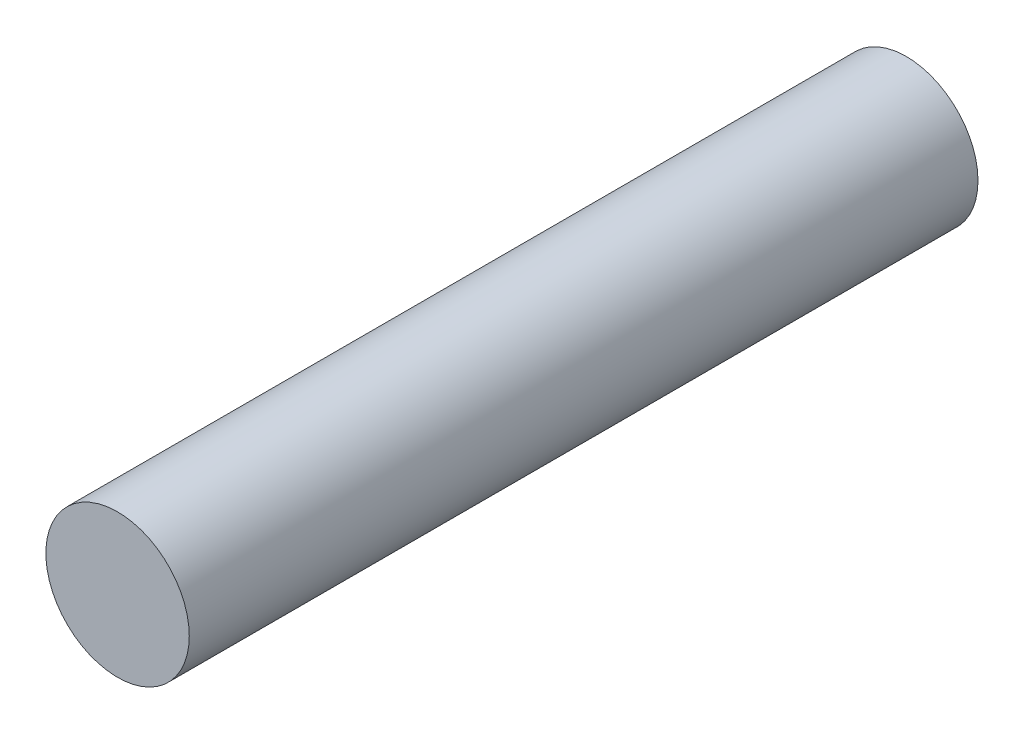
ISO-10303-21;
HEADER;
FILE_DESCRIPTION(('STEP AP214'),'2;1');
FILE_NAME('part.step','',(''),(''),'','','');
FILE_SCHEMA(('AUTOMOTIVE_DESIGN { 1 0 10303 214 1 1 1 1 }'));
ENDSEC;
DATA;
#1=APPLICATION_CONTEXT('core data for automotive mechanical design processes');
#2=APPLICATION_PROTOCOL_DEFINITION('international standard','automotive_design',2000,#1);
#3=PRODUCT_CONTEXT('',#1,'mechanical');
#4=PRODUCT('Part','Part','',(#3));
#5=PRODUCT_RELATED_PRODUCT_CATEGORY('part','',(#4));
#6=PRODUCT_DEFINITION_FORMATION('','',#4);
#7=PRODUCT_DEFINITION_CONTEXT('part definition',#1,'design');
#8=PRODUCT_DEFINITION('design','',#6,#7);
#9=PRODUCT_DEFINITION_SHAPE('','',#8);
#10=(LENGTH_UNIT() NAMED_UNIT(*) SI_UNIT(.MILLI.,.METRE.));
#11=(NAMED_UNIT(*) PLANE_ANGLE_UNIT() SI_UNIT($,.RADIAN.));
#12=(NAMED_UNIT(*) SI_UNIT($,.STERADIAN.) SOLID_ANGLE_UNIT());
#13=UNCERTAINTY_MEASURE_WITH_UNIT(LENGTH_MEASURE(1.E-05),#10,'distance_accuracy_value','');
#14=(GEOMETRIC_REPRESENTATION_CONTEXT(3) GLOBAL_UNCERTAINTY_ASSIGNED_CONTEXT((#13)) GLOBAL_UNIT_ASSIGNED_CONTEXT((#10,
#11,#12)) REPRESENTATION_CONTEXT('',''));
#15=CARTESIAN_POINT('',(0.,0.,0.));
#16=DIRECTION('',(0.,0.,1.));
#17=DIRECTION('',(1.,0.,0.));
#18=AXIS2_PLACEMENT_3D('',#15,#16,#17);
#19=CARTESIAN_POINT('',(0.,0.,11.));
#20=DIRECTION('',(0.,0.,-1.));
#21=DIRECTION('',(-1.,0.,0.));
#22=AXIS2_PLACEMENT_3D('',#19,#20,#21);
#23=CYLINDRICAL_SURFACE('',#22,1.);
#24=CARTESIAN_POINT('',(0.,0.,11.));
#25=DIRECTION('',(0.,0.,1.));
#26=DIRECTION('',(1.,0.,0.));
#27=AXIS2_PLACEMENT_3D('',#24,#25,#26);
#28=CIRCLE('',#27,1.);
#29=CARTESIAN_POINT('',(1.,0.,11.));
#30=VERTEX_POINT('',#29);
#31=EDGE_CURVE('E10',#30,#30,#28,.T.);
#32=ORIENTED_EDGE('',*,*,#31,.F.);
#33=EDGE_LOOP('',(#32));
#34=FACE_BOUND('',#33,.T.);
#35=CARTESIAN_POINT('',(0.,0.,0.));
#36=DIRECTION('',(0.,0.,1.));
#37=DIRECTION('',(1.,0.,0.));
#38=AXIS2_PLACEMENT_3D('',#35,#36,#37);
#39=CIRCLE('',#38,1.);
#40=CARTESIAN_POINT('',(1.,0.,0.));
#41=VERTEX_POINT('',#40);
#42=EDGE_CURVE('E44',#41,#41,#39,.T.);
#43=ORIENTED_EDGE('',*,*,#42,.T.);
#44=EDGE_LOOP('',(#43));
#45=FACE_BOUND('',#44,.T.);
#46=ADVANCED_FACE('F41',(#34,#45),#23,.T.);
#47=CARTESIAN_POINT('',(0.,0.,11.));
#48=DIRECTION('',(0.,0.,1.));
#49=DIRECTION('',(1.,0.,0.));
#50=AXIS2_PLACEMENT_3D('',#47,#48,#49);
#51=PLANE('',#50);
#52=ORIENTED_EDGE('',*,*,#31,.T.);
#53=EDGE_LOOP('',(#52));
#54=FACE_BOUND('',#53,.T.);
#55=ADVANCED_FACE('F56',(#54),#51,.T.);
#56=CARTESIAN_POINT('',(0.,0.,0.));
#57=DIRECTION('',(0.,0.,1.));
#58=DIRECTION('',(1.,0.,0.));
#59=AXIS2_PLACEMENT_3D('',#56,#57,#58);
#60=PLANE('',#59);
#61=ORIENTED_EDGE('',*,*,#42,.F.);
#62=EDGE_LOOP('',(#61));
#63=FACE_BOUND('',#62,.T.);
#64=ADVANCED_FACE('F54',(#63),#60,.F.);
#65=CLOSED_SHELL('',(#46,#55,#64));
#66=MANIFOLD_SOLID_BREP('B2',#65);
#67=ADVANCED_BREP_SHAPE_REPRESENTATION('',(#18,#66),#14);
#68=SHAPE_DEFINITION_REPRESENTATION(#9,#67);
ENDSEC;
END-ISO-10303-21;
